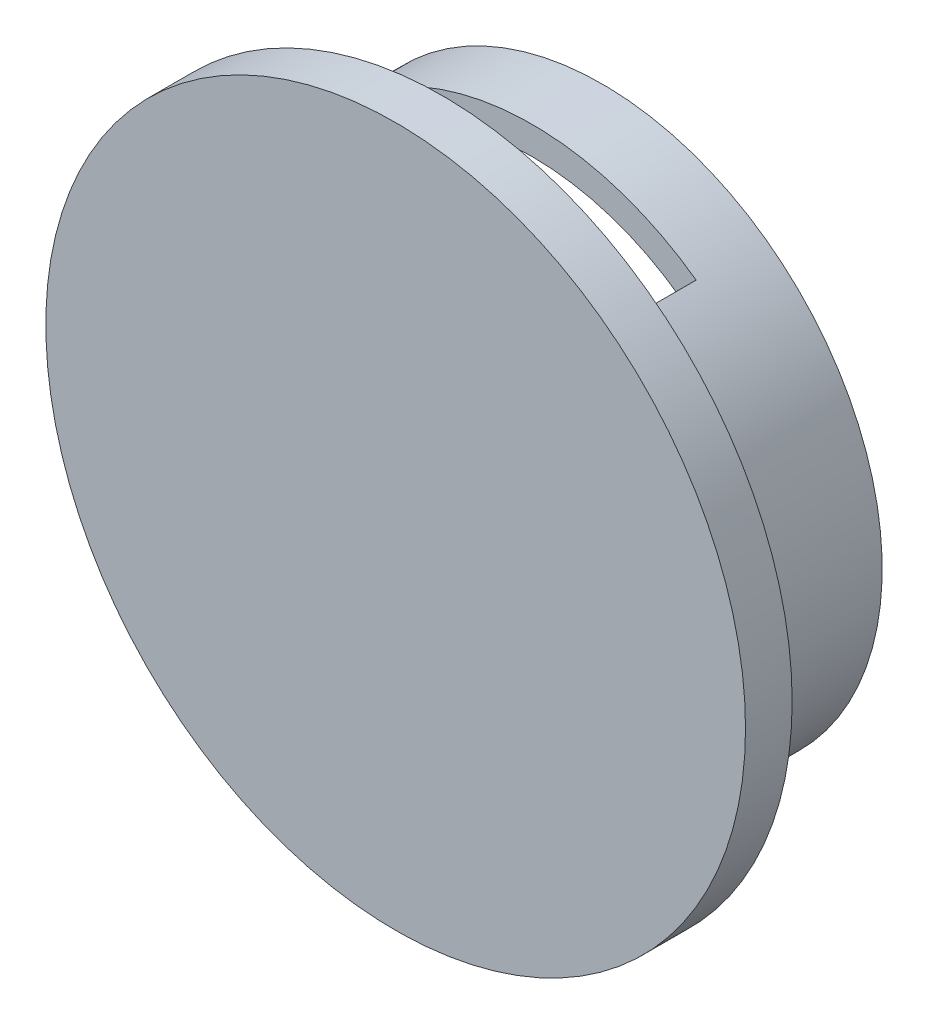
ISO-10303-21;
HEADER;
FILE_DESCRIPTION(('STEP AP214'),'2;1');
FILE_NAME('part.step','',(''),(''),'','','');
FILE_SCHEMA(('AUTOMOTIVE_DESIGN { 1 0 10303 214 1 1 1 1 }'));
ENDSEC;
DATA;
#1=APPLICATION_CONTEXT('core data for automotive mechanical design processes');
#2=APPLICATION_PROTOCOL_DEFINITION('international standard','automotive_design',2000,#1);
#3=PRODUCT_CONTEXT('',#1,'mechanical');
#4=PRODUCT('Part','Part','',(#3));
#5=PRODUCT_RELATED_PRODUCT_CATEGORY('part','',(#4));
#6=PRODUCT_DEFINITION_FORMATION('','',#4);
#7=PRODUCT_DEFINITION_CONTEXT('part definition',#1,'design');
#8=PRODUCT_DEFINITION('design','',#6,#7);
#9=PRODUCT_DEFINITION_SHAPE('','',#8);
#10=(LENGTH_UNIT() NAMED_UNIT(*) SI_UNIT(.MILLI.,.METRE.));
#11=(NAMED_UNIT(*) PLANE_ANGLE_UNIT() SI_UNIT($,.RADIAN.));
#12=(NAMED_UNIT(*) SI_UNIT($,.STERADIAN.) SOLID_ANGLE_UNIT());
#13=UNCERTAINTY_MEASURE_WITH_UNIT(LENGTH_MEASURE(1.E-05),#10,'distance_accuracy_value','');
#14=(GEOMETRIC_REPRESENTATION_CONTEXT(3) GLOBAL_UNCERTAINTY_ASSIGNED_CONTEXT((#13)) GLOBAL_UNIT_ASSIGNED_CONTEXT((#10,
#11,#12)) REPRESENTATION_CONTEXT('',''));
#15=CARTESIAN_POINT('',(0.,0.,0.));
#16=DIRECTION('',(0.,0.,1.));
#17=DIRECTION('',(1.,0.,0.));
#18=AXIS2_PLACEMENT_3D('',#15,#16,#17);
#19=CARTESIAN_POINT('',(-75.9341595570204,0.,-9.3));
#20=DIRECTION('',(1.,0.,0.));
#21=DIRECTION('',(0.,0.,-1.));
#22=AXIS2_PLACEMENT_3D('',#19,#20,#21);
#23=PLANE('',#22);
#24=DIRECTION('',(0.,0.,-1.));
#25=VECTOR('',#24,1.);
#26=CARTESIAN_POINT('',(-75.9341595570204,-19.4313729701298,-9.3));
#27=LINE('',#26,#25);
#28=CARTESIAN_POINT('',(-75.9341595570204,-19.4313729701298,-9.3));
#29=VERTEX_POINT('',#28);
#30=CARTESIAN_POINT('',(-75.9341595570204,-19.4313729701298,-19.3));
#31=VERTEX_POINT('',#30);
#32=EDGE_CURVE('E231',#29,#31,#27,.T.);
#33=ORIENTED_EDGE('',*,*,#32,.T.);
#34=DIRECTION('',(0.,-1.,0.));
#35=VECTOR('',#34,1.);
#36=CARTESIAN_POINT('',(-75.9341595570204,-11.7116516814641,-19.3));
#37=LINE('',#36,#35);
#38=CARTESIAN_POINT('',(-75.9341595570204,-11.7116516814641,-19.3));
#39=VERTEX_POINT('',#38);
#40=EDGE_CURVE('E214',#39,#31,#37,.T.);
#41=ORIENTED_EDGE('',*,*,#40,.F.);
#42=DIRECTION('',(0.,0.,-1.));
#43=VECTOR('',#42,1.);
#44=CARTESIAN_POINT('',(-75.9341595570204,-11.7116516814641,-9.3));
#45=LINE('',#44,#43);
#46=CARTESIAN_POINT('',(-75.9341595570204,-11.7116516814641,-9.3));
#47=VERTEX_POINT('',#46);
#48=EDGE_CURVE('E261',#47,#39,#45,.T.);
#49=ORIENTED_EDGE('',*,*,#48,.F.);
#50=DIRECTION('',(0.,-1.,0.));
#51=VECTOR('',#50,1.);
#52=CARTESIAN_POINT('',(-75.9341595570204,0.,-9.3));
#53=LINE('',#52,#51);
#54=EDGE_CURVE('E227',#47,#29,#53,.T.);
#55=ORIENTED_EDGE('',*,*,#54,.T.);
#56=EDGE_LOOP('',(#33,#41,#49,#55));
#57=FACE_BOUND('',#56,.T.);
#58=ADVANCED_FACE('F42',(#57),#23,.T.);
#59=CARTESIAN_POINT('',(-5.03918598073171,0.,-9.3));
#60=DIRECTION('',(1.,0.,0.));
#61=DIRECTION('',(0.,0.,-1.));
#62=AXIS2_PLACEMENT_3D('',#59,#60,#61);
#63=PLANE('',#62);
#64=DIRECTION('',(0.,-1.,0.));
#65=VECTOR('',#64,1.);
#66=CARTESIAN_POINT('',(-5.03918598073171,-12.2956066923593,-19.3));
#67=LINE('',#66,#65);
#68=CARTESIAN_POINT('',(-5.03918598073171,-12.2956066923593,-19.3));
#69=VERTEX_POINT('',#68);
#70=CARTESIAN_POINT('',(-5.03918598073171,-19.922761197767,-19.3));
#71=VERTEX_POINT('',#70);
#72=EDGE_CURVE('E64',#69,#71,#67,.T.);
#73=ORIENTED_EDGE('',*,*,#72,.T.);
#74=DIRECTION('',(0.,0.,-1.));
#75=VECTOR('',#74,1.);
#76=CARTESIAN_POINT('',(-5.03918598073171,-19.922761197767,-9.3));
#77=LINE('',#76,#75);
#78=CARTESIAN_POINT('',(-5.03918598073171,-19.922761197767,-9.3));
#79=VERTEX_POINT('',#78);
#80=EDGE_CURVE('E264',#79,#71,#77,.T.);
#81=ORIENTED_EDGE('',*,*,#80,.F.);
#82=DIRECTION('',(0.,-1.,0.));
#83=VECTOR('',#82,1.);
#84=CARTESIAN_POINT('',(-5.03918598073171,0.,-9.3));
#85=LINE('',#84,#83);
#86=CARTESIAN_POINT('',(-5.03918598073171,-12.2956066923593,-9.3));
#87=VERTEX_POINT('',#86);
#88=EDGE_CURVE('E255',#87,#79,#85,.T.);
#89=ORIENTED_EDGE('',*,*,#88,.F.);
#90=DIRECTION('',(0.,0.,-1.));
#91=VECTOR('',#90,1.);
#92=CARTESIAN_POINT('',(-5.03918598073171,-12.2956066923593,-9.3));
#93=LINE('',#92,#91);
#94=EDGE_CURVE('E59',#87,#69,#93,.T.);
#95=ORIENTED_EDGE('',*,*,#94,.T.);
#96=EDGE_LOOP('',(#73,#81,#89,#95));
#97=FACE_BOUND('',#96,.T.);
#98=ADVANCED_FACE('F299',(#97),#63,.F.);
#99=CARTESIAN_POINT('',(-40.1511488367741,28.7306052263141,-34.3));
#100=DIRECTION('',(0.,0.,1.));
#101=DIRECTION('',(1.,0.,0.));
#102=AXIS2_PLACEMENT_3D('',#99,#100,#101);
#103=CYLINDRICAL_SURFACE('',#102,60.);
#104=CARTESIAN_POINT('',(-40.1511488367741,28.7306052263141,-34.3));
#105=DIRECTION('',(0.,0.,-1.));
#106=DIRECTION('',(-1.,0.,0.));
#107=AXIS2_PLACEMENT_3D('',#104,#105,#106);
#108=CIRCLE('',#107,60.);
#109=CARTESIAN_POINT('',(-100.151148836774,28.7306052263141,-34.3));
#110=VERTEX_POINT('',#109);
#111=EDGE_CURVE('E274',#110,#110,#108,.T.);
#112=ORIENTED_EDGE('',*,*,#111,.F.);
#113=EDGE_LOOP('',(#112));
#114=FACE_BOUND('',#113,.T.);
#115=CARTESIAN_POINT('',(-40.1511488367741,28.7306052263148,-19.3));
#116=DIRECTION('',(0.,0.,-1.));
#117=DIRECTION('',(-1.,0.,0.));
#118=AXIS2_PLACEMENT_3D('',#115,#116,#117);
#119=CIRCLE('',#118,60.0000000000006);
#120=EDGE_CURVE('E211',#71,#31,#119,.T.);
#121=ORIENTED_EDGE('',*,*,#120,.T.);
#122=ORIENTED_EDGE('',*,*,#32,.F.);
#123=CARTESIAN_POINT('',(-40.1511488367741,28.7306052263141,-9.3));
#124=DIRECTION('',(0.,0.,-1.));
#125=DIRECTION('',(-1.,0.,0.));
#126=AXIS2_PLACEMENT_3D('',#123,#124,#125);
#127=CIRCLE('',#126,60.);
#128=EDGE_CURVE('E258',#79,#29,#127,.T.);
#129=ORIENTED_EDGE('',*,*,#128,.F.);
#130=ORIENTED_EDGE('',*,*,#80,.T.);
#131=EDGE_LOOP('',(#121,#122,#129,#130));
#132=FACE_BOUND('',#131,.T.);
#133=CARTESIAN_POINT('',(-40.1511488367741,28.7306052263141,0.));
#134=DIRECTION('',(0.,0.,-1.));
#135=DIRECTION('',(-1.,0.,0.));
#136=AXIS2_PLACEMENT_3D('',#133,#134,#135);
#137=CIRCLE('',#136,60.);
#138=CARTESIAN_POINT('',(-100.151148836774,28.7306052263141,0.));
#139=VERTEX_POINT('',#138);
#140=EDGE_CURVE('E12',#139,#139,#137,.T.);
#141=ORIENTED_EDGE('',*,*,#140,.T.);
#142=EDGE_LOOP('',(#141));
#143=FACE_BOUND('',#142,.T.);
#144=DIRECTION('',(0.,0.,-1.));
#145=VECTOR('',#144,1.);
#146=CARTESIAN_POINT('',(-75.2631116928165,77.3839716503952,-9.3));
#147=LINE('',#146,#145);
#148=CARTESIAN_POINT('',(-75.2631116928165,77.3839716503952,-9.3));
#149=VERTEX_POINT('',#148);
#150=CARTESIAN_POINT('',(-75.2631116928165,77.3839716503952,-19.3));
#151=VERTEX_POINT('',#150);
#152=EDGE_CURVE('E239',#149,#151,#147,.T.);
#153=ORIENTED_EDGE('',*,*,#152,.T.);
#154=CARTESIAN_POINT('',(-40.1511488367741,28.7306052263142,-19.3));
#155=DIRECTION('',(0.,0.,1.));
#156=DIRECTION('',(1.,0.,0.));
#157=AXIS2_PLACEMENT_3D('',#154,#155,#156);
#158=CIRCLE('',#157,59.9999999999999);
#159=CARTESIAN_POINT('',(-5.03918598073171,77.3839716503952,-19.3));
#160=VERTEX_POINT('',#159);
#161=EDGE_CURVE('E218',#160,#151,#158,.T.);
#162=ORIENTED_EDGE('',*,*,#161,.F.);
#163=DIRECTION('',(0.,0.,-1.));
#164=VECTOR('',#163,1.);
#165=CARTESIAN_POINT('',(-5.03918598073171,77.3839716503952,-9.3));
#166=LINE('',#165,#164);
#167=CARTESIAN_POINT('',(-5.03918598073171,77.3839716503952,-9.3));
#168=VERTEX_POINT('',#167);
#169=EDGE_CURVE('E247',#168,#160,#166,.T.);
#170=ORIENTED_EDGE('',*,*,#169,.F.);
#171=CARTESIAN_POINT('',(-40.1511488367741,28.7306052263141,-9.3));
#172=DIRECTION('',(0.,0.,-1.));
#173=DIRECTION('',(-1.,0.,0.));
#174=AXIS2_PLACEMENT_3D('',#171,#172,#173);
#175=CIRCLE('',#174,60.);
#176=EDGE_CURVE('E230',#149,#168,#175,.T.);
#177=ORIENTED_EDGE('',*,*,#176,.F.);
#178=EDGE_LOOP('',(#153,#162,#170,#177));
#179=FACE_BOUND('',#178,.T.);
#180=ADVANCED_FACE('F306',(#114,#132,#143,#179),#103,.T.);
#181=CARTESIAN_POINT('',(-40.1511488367741,28.7306052263141,-34.3));
#182=DIRECTION('',(0.,0.,-1.));
#183=DIRECTION('',(-1.,0.,0.));
#184=AXIS2_PLACEMENT_3D('',#181,#182,#183);
#185=PLANE('',#184);
#186=ORIENTED_EDGE('',*,*,#111,.T.);
#187=EDGE_LOOP('',(#186));
#188=FACE_BOUND('',#187,.T.);
#189=CARTESIAN_POINT('',(-40.1511488367741,28.7306052263141,-34.3));
#190=DIRECTION('',(0.,0.,-1.));
#191=DIRECTION('',(-1.,0.,0.));
#192=AXIS2_PLACEMENT_3D('',#189,#190,#191);
#193=CIRCLE('',#192,54.);
#194=CARTESIAN_POINT('',(-94.1511488367741,28.7306052263141,-34.3));
#195=VERTEX_POINT('',#194);
#196=EDGE_CURVE('E243',#195,#195,#193,.T.);
#197=ORIENTED_EDGE('',*,*,#196,.F.);
#198=EDGE_LOOP('',(#197));
#199=FACE_BOUND('',#198,.T.);
#200=ADVANCED_FACE('F313',(#188,#199),#185,.T.);
#201=CARTESIAN_POINT('',(-40.1511488367741,28.7306052263141,-34.3));
#202=DIRECTION('',(0.,0.,1.));
#203=DIRECTION('',(1.,0.,0.));
#204=AXIS2_PLACEMENT_3D('',#201,#202,#203);
#205=CYLINDRICAL_SURFACE('',#204,54.);
#206=ORIENTED_EDGE('',*,*,#196,.T.);
#207=EDGE_LOOP('',(#206));
#208=FACE_BOUND('',#207,.T.);
#209=ORIENTED_EDGE('',*,*,#48,.T.);
#210=CARTESIAN_POINT('',(-40.1511488367741,28.7306052263142,-19.3));
#211=DIRECTION('',(0.,0.,-1.));
#212=DIRECTION('',(-1.,0.,0.));
#213=AXIS2_PLACEMENT_3D('',#210,#211,#212);
#214=CIRCLE('',#213,54.0000000000001);
#215=EDGE_CURVE('E216',#69,#39,#214,.T.);
#216=ORIENTED_EDGE('',*,*,#215,.F.);
#217=ORIENTED_EDGE('',*,*,#94,.F.);
#218=CARTESIAN_POINT('',(-40.1511488367741,28.7306052263141,-9.3));
#219=DIRECTION('',(0.,0.,-1.));
#220=DIRECTION('',(-1.,0.,0.));
#221=AXIS2_PLACEMENT_3D('',#218,#219,#220);
#222=CIRCLE('',#221,54.);
#223=EDGE_CURVE('E252',#47,#87,#222,.F.);
#224=ORIENTED_EDGE('',*,*,#223,.F.);
#225=EDGE_LOOP('',(#209,#216,#217,#224));
#226=FACE_BOUND('',#225,.T.);
#227=CARTESIAN_POINT('',(-40.1511488367741,28.7306052263141,4.));
#228=DIRECTION('',(0.,0.,1.));
#229=DIRECTION('',(1.,0.,0.));
#230=AXIS2_PLACEMENT_3D('',#227,#228,#229);
#231=CIRCLE('',#230,54.);
#232=CARTESIAN_POINT('',(13.8488511632259,28.7306052263141,4.));
#233=VERTEX_POINT('',#232);
#234=EDGE_CURVE('E271',#233,#233,#231,.F.);
#235=ORIENTED_EDGE('',*,*,#234,.F.);
#236=EDGE_LOOP('',(#235));
#237=FACE_BOUND('',#236,.T.);
#238=CARTESIAN_POINT('',(-40.1511488367741,28.730605226314,-19.3));
#239=DIRECTION('',(0.,0.,1.));
#240=DIRECTION('',(1.,0.,0.));
#241=AXIS2_PLACEMENT_3D('',#238,#239,#240);
#242=CIRCLE('',#241,54.0000000000001);
#243=CARTESIAN_POINT('',(-5.03918598073171,69.7568171449875,-19.3));
#244=VERTEX_POINT('',#243);
#245=CARTESIAN_POINT('',(-75.2631116928165,69.7568171449875,-19.3));
#246=VERTEX_POINT('',#245);
#247=EDGE_CURVE('E222',#244,#246,#242,.T.);
#248=ORIENTED_EDGE('',*,*,#247,.T.);
#249=DIRECTION('',(0.,0.,-1.));
#250=VECTOR('',#249,1.);
#251=CARTESIAN_POINT('',(-75.2631116928165,69.7568171449875,-9.3));
#252=LINE('',#251,#250);
#253=CARTESIAN_POINT('',(-75.2631116928165,69.7568171449875,-9.3));
#254=VERTEX_POINT('',#253);
#255=EDGE_CURVE('E240',#254,#246,#252,.T.);
#256=ORIENTED_EDGE('',*,*,#255,.F.);
#257=CARTESIAN_POINT('',(-40.1511488367741,28.7306052263141,-9.3));
#258=DIRECTION('',(0.,0.,-1.));
#259=DIRECTION('',(-1.,0.,0.));
#260=AXIS2_PLACEMENT_3D('',#257,#258,#259);
#261=CIRCLE('',#260,54.);
#262=CARTESIAN_POINT('',(-5.0391859807317,69.7568171449875,-9.3));
#263=VERTEX_POINT('',#262);
#264=EDGE_CURVE('E236',#263,#254,#261,.F.);
#265=ORIENTED_EDGE('',*,*,#264,.F.);
#266=DIRECTION('',(0.,0.,-1.));
#267=VECTOR('',#266,1.);
#268=CARTESIAN_POINT('',(-5.03918598073171,69.7568171449875,-9.3));
#269=LINE('',#268,#267);
#270=EDGE_CURVE('E244',#263,#244,#269,.T.);
#271=ORIENTED_EDGE('',*,*,#270,.T.);
#272=EDGE_LOOP('',(#248,#256,#265,#271));
#273=FACE_BOUND('',#272,.T.);
#274=ADVANCED_FACE('F310',(#208,#226,#237,#273),#205,.F.);
#275=CARTESIAN_POINT('',(-40.1511488367741,28.7306052263141,10.));
#276=DIRECTION('',(0.,0.,-1.));
#277=DIRECTION('',(-1.,0.,0.));
#278=AXIS2_PLACEMENT_3D('',#275,#276,#277);
#279=CYLINDRICAL_SURFACE('',#278,75.);
#280=CARTESIAN_POINT('',(-40.1511488367741,28.7306052263141,10.));
#281=DIRECTION('',(0.,0.,1.));
#282=DIRECTION('',(1.,0.,0.));
#283=AXIS2_PLACEMENT_3D('',#280,#281,#282);
#284=CIRCLE('',#283,75.);
#285=CARTESIAN_POINT('',(34.8488511632259,28.7306052263141,10.));
#286=VERTEX_POINT('',#285);
#287=EDGE_CURVE('E51',#286,#286,#284,.T.);
#288=ORIENTED_EDGE('',*,*,#287,.F.);
#289=EDGE_LOOP('',(#288));
#290=FACE_BOUND('',#289,.T.);
#291=CARTESIAN_POINT('',(-40.1511488367741,28.7306052263141,0.));
#292=DIRECTION('',(0.,0.,1.));
#293=DIRECTION('',(1.,0.,0.));
#294=AXIS2_PLACEMENT_3D('',#291,#292,#293);
#295=CIRCLE('',#294,75.);
#296=CARTESIAN_POINT('',(34.8488511632259,28.7306052263141,0.));
#297=VERTEX_POINT('',#296);
#298=EDGE_CURVE('E46',#297,#297,#295,.T.);
#299=ORIENTED_EDGE('',*,*,#298,.T.);
#300=EDGE_LOOP('',(#299));
#301=FACE_BOUND('',#300,.T.);
#302=ADVANCED_FACE('F44',(#290,#301),#279,.T.);
#303=CARTESIAN_POINT('',(-40.1511488367741,28.7306052263141,10.));
#304=DIRECTION('',(0.,0.,1.));
#305=DIRECTION('',(1.,0.,0.));
#306=AXIS2_PLACEMENT_3D('',#303,#304,#305);
#307=PLANE('',#306);
#308=ORIENTED_EDGE('',*,*,#287,.T.);
#309=EDGE_LOOP('',(#308));
#310=FACE_BOUND('',#309,.T.);
#311=ADVANCED_FACE('F286',(#310),#307,.T.);
#312=CARTESIAN_POINT('',(-40.1511488367741,28.7306052263141,0.));
#313=DIRECTION('',(0.,0.,1.));
#314=DIRECTION('',(1.,0.,0.));
#315=AXIS2_PLACEMENT_3D('',#312,#313,#314);
#316=PLANE('',#315);
#317=ORIENTED_EDGE('',*,*,#140,.F.);
#318=EDGE_LOOP('',(#317));
#319=FACE_BOUND('',#318,.T.);
#320=ORIENTED_EDGE('',*,*,#298,.F.);
#321=EDGE_LOOP('',(#320));
#322=FACE_BOUND('',#321,.T.);
#323=ADVANCED_FACE('F283',(#319,#322),#316,.F.);
#324=CARTESIAN_POINT('',(-40.1511488367741,28.7306052263141,4.));
#325=DIRECTION('',(0.,0.,1.));
#326=DIRECTION('',(1.,0.,0.));
#327=AXIS2_PLACEMENT_3D('',#324,#325,#326);
#328=PLANE('',#327);
#329=CARTESIAN_POINT('',(-10.0991106363457,58.7826434267423,4.));
#330=DIRECTION('',(0.,0.,-1.));
#331=DIRECTION('',(-1.,0.,0.));
#332=AXIS2_PLACEMENT_3D('',#329,#330,#331);
#333=CIRCLE('',#332,1.775);
#334=CARTESIAN_POINT('',(-11.8741106363457,58.7826434267423,4.));
#335=VERTEX_POINT('',#334);
#336=EDGE_CURVE('E147',#335,#335,#333,.T.);
#337=ORIENTED_EDGE('',*,*,#336,.F.);
#338=EDGE_LOOP('',(#337));
#339=FACE_BOUND('',#338,.T.);
#340=CARTESIAN_POINT('',(-70.2031870372023,58.7826434267424,4.));
#341=DIRECTION('',(0.,0.,-1.));
#342=DIRECTION('',(-1.,0.,0.));
#343=AXIS2_PLACEMENT_3D('',#340,#341,#342);
#344=CIRCLE('',#343,1.775);
#345=CARTESIAN_POINT('',(-71.9781870372023,58.7826434267424,4.));
#346=VERTEX_POINT('',#345);
#347=EDGE_CURVE('E140',#346,#346,#344,.T.);
#348=ORIENTED_EDGE('',*,*,#347,.F.);
#349=EDGE_LOOP('',(#348));
#350=FACE_BOUND('',#349,.T.);
#351=CARTESIAN_POINT('',(-70.2031870372024,-1.3214329741141,4.));
#352=DIRECTION('',(0.,0.,-1.));
#353=DIRECTION('',(-1.,0.,0.));
#354=AXIS2_PLACEMENT_3D('',#351,#352,#353);
#355=CIRCLE('',#354,1.775);
#356=CARTESIAN_POINT('',(-71.9781870372024,-1.3214329741141,4.));
#357=VERTEX_POINT('',#356);
#358=EDGE_CURVE('E156',#357,#357,#355,.T.);
#359=ORIENTED_EDGE('',*,*,#358,.F.);
#360=EDGE_LOOP('',(#359));
#361=FACE_BOUND('',#360,.T.);
#362=CARTESIAN_POINT('',(-10.0991106363459,-1.32143297411421,4.));
#363=DIRECTION('',(0.,0.,-1.));
#364=DIRECTION('',(-1.,0.,0.));
#365=AXIS2_PLACEMENT_3D('',#362,#363,#364);
#366=CIRCLE('',#365,1.775);
#367=CARTESIAN_POINT('',(-11.8741106363459,-1.32143297411421,4.));
#368=VERTEX_POINT('',#367);
#369=EDGE_CURVE('E165',#368,#368,#366,.T.);
#370=ORIENTED_EDGE('',*,*,#369,.F.);
#371=EDGE_LOOP('',(#370));
#372=FACE_BOUND('',#371,.T.);
#373=CARTESIAN_POINT('',(-40.1511488367741,71.2306052263141,4.));
#374=DIRECTION('',(0.,0.,-1.));
#375=DIRECTION('',(-1.,0.,0.));
#376=AXIS2_PLACEMENT_3D('',#373,#374,#375);
#377=CIRCLE('',#376,1.775);
#378=CARTESIAN_POINT('',(-41.9261488367741,71.2306052263141,4.));
#379=VERTEX_POINT('',#378);
#380=EDGE_CURVE('E174',#379,#379,#377,.T.);
#381=ORIENTED_EDGE('',*,*,#380,.F.);
#382=EDGE_LOOP('',(#381));
#383=FACE_BOUND('',#382,.T.);
#384=CARTESIAN_POINT('',(-82.6511488367741,28.7306052263141,4.));
#385=DIRECTION('',(0.,0.,-1.));
#386=DIRECTION('',(-1.,0.,0.));
#387=AXIS2_PLACEMENT_3D('',#384,#385,#386);
#388=CIRCLE('',#387,1.775);
#389=CARTESIAN_POINT('',(-84.4261488367741,28.7306052263141,4.));
#390=VERTEX_POINT('',#389);
#391=EDGE_CURVE('E183',#390,#390,#388,.T.);
#392=ORIENTED_EDGE('',*,*,#391,.F.);
#393=EDGE_LOOP('',(#392));
#394=FACE_BOUND('',#393,.T.);
#395=CARTESIAN_POINT('',(-40.1511488367741,-13.7693947736859,4.));
#396=DIRECTION('',(0.,0.,-1.));
#397=DIRECTION('',(-1.,0.,0.));
#398=AXIS2_PLACEMENT_3D('',#395,#396,#397);
#399=CIRCLE('',#398,1.775);
#400=CARTESIAN_POINT('',(-41.9261488367741,-13.7693947736859,4.));
#401=VERTEX_POINT('',#400);
#402=EDGE_CURVE('E192',#401,#401,#399,.T.);
#403=ORIENTED_EDGE('',*,*,#402,.F.);
#404=EDGE_LOOP('',(#403));
#405=FACE_BOUND('',#404,.T.);
#406=CARTESIAN_POINT('',(2.34885116322592,28.7306052263141,4.));
#407=DIRECTION('',(0.,0.,-1.));
#408=DIRECTION('',(-1.,0.,0.));
#409=AXIS2_PLACEMENT_3D('',#406,#407,#408);
#410=CIRCLE('',#409,1.775);
#411=CARTESIAN_POINT('',(0.573851163225917,28.7306052263141,4.));
#412=VERTEX_POINT('',#411);
#413=EDGE_CURVE('E201',#412,#412,#410,.T.);
#414=ORIENTED_EDGE('',*,*,#413,.F.);
#415=EDGE_LOOP('',(#414));
#416=FACE_BOUND('',#415,.T.);
#417=ORIENTED_EDGE('',*,*,#234,.T.);
#418=EDGE_LOOP('',(#417));
#419=FACE_BOUND('',#418,.T.);
#420=ADVANCED_FACE('F285',(#339,#350,#361,#372,#383,#394,#405,#416,#419),#328,.F.);
#421=CARTESIAN_POINT('',(0.,0.,-9.3));
#422=DIRECTION('',(0.,0.,-1.));
#423=DIRECTION('',(-1.,0.,0.));
#424=AXIS2_PLACEMENT_3D('',#421,#422,#423);
#425=PLANE('',#424);
#426=ORIENTED_EDGE('',*,*,#54,.F.);
#427=ORIENTED_EDGE('',*,*,#223,.T.);
#428=ORIENTED_EDGE('',*,*,#88,.T.);
#429=ORIENTED_EDGE('',*,*,#128,.T.);
#430=EDGE_LOOP('',(#426,#427,#428,#429));
#431=FACE_BOUND('',#430,.T.);
#432=ADVANCED_FACE('F293',(#431),#425,.T.);
#433=CARTESIAN_POINT('',(-75.2631116928165,0.,-9.3));
#434=DIRECTION('',(1.,0.,0.));
#435=DIRECTION('',(0.,0.,-1.));
#436=AXIS2_PLACEMENT_3D('',#433,#434,#435);
#437=PLANE('',#436);
#438=DIRECTION('',(0.,-1.,0.));
#439=VECTOR('',#438,1.);
#440=CARTESIAN_POINT('',(-75.2631116928165,77.3839716503952,-19.3));
#441=LINE('',#440,#439);
#442=EDGE_CURVE('E220',#151,#246,#441,.T.);
#443=ORIENTED_EDGE('',*,*,#442,.F.);
#444=ORIENTED_EDGE('',*,*,#152,.F.);
#445=DIRECTION('',(0.,-1.,0.));
#446=VECTOR('',#445,1.);
#447=CARTESIAN_POINT('',(-75.2631116928165,0.,-9.3));
#448=LINE('',#447,#446);
#449=EDGE_CURVE('E228',#149,#254,#448,.T.);
#450=ORIENTED_EDGE('',*,*,#449,.T.);
#451=ORIENTED_EDGE('',*,*,#255,.T.);
#452=EDGE_LOOP('',(#443,#444,#450,#451));
#453=FACE_BOUND('',#452,.T.);
#454=ADVANCED_FACE('F335',(#453),#437,.T.);
#455=CARTESIAN_POINT('',(-5.03918598073171,0.,-9.3));
#456=DIRECTION('',(1.,0.,0.));
#457=DIRECTION('',(0.,0.,-1.));
#458=AXIS2_PLACEMENT_3D('',#455,#456,#457);
#459=PLANE('',#458);
#460=ORIENTED_EDGE('',*,*,#169,.T.);
#461=DIRECTION('',(0.,-1.,0.));
#462=VECTOR('',#461,1.);
#463=CARTESIAN_POINT('',(-5.03918598073171,77.3839716503952,-19.3));
#464=LINE('',#463,#462);
#465=EDGE_CURVE('E225',#160,#244,#464,.T.);
#466=ORIENTED_EDGE('',*,*,#465,.T.);
#467=ORIENTED_EDGE('',*,*,#270,.F.);
#468=DIRECTION('',(0.,-1.,0.));
#469=VECTOR('',#468,1.);
#470=CARTESIAN_POINT('',(-5.03918598073171,0.,-9.3));
#471=LINE('',#470,#469);
#472=EDGE_CURVE('E234',#168,#263,#471,.T.);
#473=ORIENTED_EDGE('',*,*,#472,.F.);
#474=EDGE_LOOP('',(#460,#466,#467,#473));
#475=FACE_BOUND('',#474,.T.);
#476=ADVANCED_FACE('F346',(#475),#459,.F.);
#477=CARTESIAN_POINT('',(0.,0.,-9.3));
#478=DIRECTION('',(0.,0.,-1.));
#479=DIRECTION('',(-1.,0.,0.));
#480=AXIS2_PLACEMENT_3D('',#477,#478,#479);
#481=PLANE('',#480);
#482=ORIENTED_EDGE('',*,*,#449,.F.);
#483=ORIENTED_EDGE('',*,*,#176,.T.);
#484=ORIENTED_EDGE('',*,*,#472,.T.);
#485=ORIENTED_EDGE('',*,*,#264,.T.);
#486=EDGE_LOOP('',(#482,#483,#484,#485));
#487=FACE_BOUND('',#486,.T.);
#488=ADVANCED_FACE('F337',(#487),#481,.T.);
#489=CARTESIAN_POINT('',(-40.1511488367741,28.7306052263142,-19.3));
#490=DIRECTION('',(0.,0.,1.));
#491=DIRECTION('',(1.,0.,0.));
#492=AXIS2_PLACEMENT_3D('',#489,#490,#491);
#493=PLANE('',#492);
#494=ORIENTED_EDGE('',*,*,#161,.T.);
#495=ORIENTED_EDGE('',*,*,#442,.T.);
#496=ORIENTED_EDGE('',*,*,#247,.F.);
#497=ORIENTED_EDGE('',*,*,#465,.F.);
#498=EDGE_LOOP('',(#494,#495,#496,#497));
#499=FACE_BOUND('',#498,.T.);
#500=ADVANCED_FACE('F344',(#499),#493,.T.);
#501=CARTESIAN_POINT('',(-40.1511488367741,28.7306052263142,-19.3));
#502=DIRECTION('',(0.,0.,-1.));
#503=DIRECTION('',(-1.,0.,0.));
#504=AXIS2_PLACEMENT_3D('',#501,#502,#503);
#505=PLANE('',#504);
#506=ORIENTED_EDGE('',*,*,#215,.T.);
#507=ORIENTED_EDGE('',*,*,#40,.T.);
#508=ORIENTED_EDGE('',*,*,#120,.F.);
#509=ORIENTED_EDGE('',*,*,#72,.F.);
#510=EDGE_LOOP('',(#506,#507,#508,#509));
#511=FACE_BOUND('',#510,.T.);
#512=ADVANCED_FACE('F366',(#511),#505,.F.);
#513=CARTESIAN_POINT('',(2.34885116322592,28.7306052263141,9.));
#514=DIRECTION('',(0.,0.,-1.));
#515=DIRECTION('',(-1.,0.,0.));
#516=AXIS2_PLACEMENT_3D('',#513,#514,#515);
#517=CONICAL_SURFACE('',#516,1.45,1.02974425867665);
#518=CARTESIAN_POINT('',(2.34885116322592,28.7306052263141,9.87124789758996));
#519=VERTEX_POINT('',#518);
#520=VERTEX_LOOP('',#519);
#521=FACE_BOUND('',#520,.T.);
#522=CARTESIAN_POINT('',(2.34885116322592,28.7306052263141,9.));
#523=DIRECTION('',(0.,0.,-1.));
#524=DIRECTION('',(-1.,0.,0.));
#525=AXIS2_PLACEMENT_3D('',#522,#523,#524);
#526=CIRCLE('',#525,1.45);
#527=CARTESIAN_POINT('',(0.89885116322592,28.7306052263141,9.));
#528=VERTEX_POINT('',#527);
#529=EDGE_CURVE('E207',#528,#528,#526,.T.);
#530=ORIENTED_EDGE('',*,*,#529,.T.);
#531=EDGE_LOOP('',(#530));
#532=FACE_BOUND('',#531,.T.);
#533=ADVANCED_FACE('F368',(#521,#532),#517,.F.);
#534=CARTESIAN_POINT('',(2.34885116322592,28.7306052263141,4.));
#535=DIRECTION('',(0.,0.,-1.));
#536=DIRECTION('',(-1.,0.,0.));
#537=AXIS2_PLACEMENT_3D('',#534,#535,#536);
#538=CYLINDRICAL_SURFACE('',#537,1.45);
#539=ORIENTED_EDGE('',*,*,#529,.F.);
#540=EDGE_LOOP('',(#539));
#541=FACE_BOUND('',#540,.T.);
#542=CARTESIAN_POINT('',(2.34885116322592,28.7306052263141,4.325));
#543=DIRECTION('',(0.,0.,-1.));
#544=DIRECTION('',(-1.,0.,0.));
#545=AXIS2_PLACEMENT_3D('',#542,#543,#544);
#546=CIRCLE('',#545,1.45);
#547=CARTESIAN_POINT('',(0.89885116322592,28.7306052263141,4.325));
#548=VERTEX_POINT('',#547);
#549=EDGE_CURVE('E204',#548,#548,#546,.T.);
#550=ORIENTED_EDGE('',*,*,#549,.T.);
#551=EDGE_LOOP('',(#550));
#552=FACE_BOUND('',#551,.T.);
#553=ADVANCED_FACE('F373',(#541,#552),#538,.F.);
#554=CARTESIAN_POINT('',(2.34885116322592,28.7306052263141,4.));
#555=DIRECTION('',(0.,0.,-1.));
#556=DIRECTION('',(-1.,0.,0.));
#557=AXIS2_PLACEMENT_3D('',#554,#555,#556);
#558=CONICAL_SURFACE('',#557,1.775,0.785398163397451);
#559=ORIENTED_EDGE('',*,*,#549,.F.);
#560=EDGE_LOOP('',(#559));
#561=FACE_BOUND('',#560,.T.);
#562=ORIENTED_EDGE('',*,*,#413,.T.);
#563=EDGE_LOOP('',(#562));
#564=FACE_BOUND('',#563,.T.);
#565=ADVANCED_FACE('F379',(#561,#564),#558,.F.);
#566=CARTESIAN_POINT('',(-40.1511488367741,-13.7693947736859,9.));
#567=DIRECTION('',(0.,0.,-1.));
#568=DIRECTION('',(-1.,0.,0.));
#569=AXIS2_PLACEMENT_3D('',#566,#567,#568);
#570=CONICAL_SURFACE('',#569,1.45,1.02974425867665);
#571=CARTESIAN_POINT('',(-40.1511488367741,-13.7693947736859,9.87124789758996));
#572=VERTEX_POINT('',#571);
#573=VERTEX_LOOP('',#572);
#574=FACE_BOUND('',#573,.T.);
#575=CARTESIAN_POINT('',(-40.1511488367741,-13.7693947736859,9.));
#576=DIRECTION('',(0.,0.,-1.));
#577=DIRECTION('',(-1.,0.,0.));
#578=AXIS2_PLACEMENT_3D('',#575,#576,#577);
#579=CIRCLE('',#578,1.45);
#580=CARTESIAN_POINT('',(-41.6011488367741,-13.7693947736859,9.));
#581=VERTEX_POINT('',#580);
#582=EDGE_CURVE('E198',#581,#581,#579,.T.);
#583=ORIENTED_EDGE('',*,*,#582,.T.);
#584=EDGE_LOOP('',(#583));
#585=FACE_BOUND('',#584,.T.);
#586=ADVANCED_FACE('F383',(#574,#585),#570,.F.);
#587=CARTESIAN_POINT('',(-40.1511488367741,-13.7693947736859,4.));
#588=DIRECTION('',(0.,0.,-1.));
#589=DIRECTION('',(-1.,0.,0.));
#590=AXIS2_PLACEMENT_3D('',#587,#588,#589);
#591=CYLINDRICAL_SURFACE('',#590,1.45);
#592=ORIENTED_EDGE('',*,*,#582,.F.);
#593=EDGE_LOOP('',(#592));
#594=FACE_BOUND('',#593,.T.);
#595=CARTESIAN_POINT('',(-40.1511488367741,-13.7693947736859,4.325));
#596=DIRECTION('',(0.,0.,-1.));
#597=DIRECTION('',(-1.,0.,0.));
#598=AXIS2_PLACEMENT_3D('',#595,#596,#597);
#599=CIRCLE('',#598,1.45);
#600=CARTESIAN_POINT('',(-41.6011488367741,-13.7693947736859,4.325));
#601=VERTEX_POINT('',#600);
#602=EDGE_CURVE('E195',#601,#601,#599,.T.);
#603=ORIENTED_EDGE('',*,*,#602,.T.);
#604=EDGE_LOOP('',(#603));
#605=FACE_BOUND('',#604,.T.);
#606=ADVANCED_FACE('F387',(#594,#605),#591,.F.);
#607=CARTESIAN_POINT('',(-40.1511488367741,-13.7693947736859,4.));
#608=DIRECTION('',(0.,0.,-1.));
#609=DIRECTION('',(-1.,0.,0.));
#610=AXIS2_PLACEMENT_3D('',#607,#608,#609);
#611=CONICAL_SURFACE('',#610,1.775,0.785398163397446);
#612=ORIENTED_EDGE('',*,*,#602,.F.);
#613=EDGE_LOOP('',(#612));
#614=FACE_BOUND('',#613,.T.);
#615=ORIENTED_EDGE('',*,*,#402,.T.);
#616=EDGE_LOOP('',(#615));
#617=FACE_BOUND('',#616,.T.);
#618=ADVANCED_FACE('F391',(#614,#617),#611,.F.);
#619=CARTESIAN_POINT('',(-82.6511488367741,28.7306052263141,9.));
#620=DIRECTION('',(0.,0.,-1.));
#621=DIRECTION('',(-1.,0.,0.));
#622=AXIS2_PLACEMENT_3D('',#619,#620,#621);
#623=CONICAL_SURFACE('',#622,1.44999999999999,1.02974425867665);
#624=CARTESIAN_POINT('',(-82.6511488367741,28.7306052263141,9.87124789758996));
#625=VERTEX_POINT('',#624);
#626=VERTEX_LOOP('',#625);
#627=FACE_BOUND('',#626,.T.);
#628=CARTESIAN_POINT('',(-82.6511488367741,28.7306052263141,9.));
#629=DIRECTION('',(0.,0.,-1.));
#630=DIRECTION('',(-1.,0.,0.));
#631=AXIS2_PLACEMENT_3D('',#628,#629,#630);
#632=CIRCLE('',#631,1.44999999999999);
#633=CARTESIAN_POINT('',(-84.1011488367741,28.7306052263141,9.));
#634=VERTEX_POINT('',#633);
#635=EDGE_CURVE('E189',#634,#634,#632,.T.);
#636=ORIENTED_EDGE('',*,*,#635,.T.);
#637=EDGE_LOOP('',(#636));
#638=FACE_BOUND('',#637,.T.);
#639=ADVANCED_FACE('F395',(#627,#638),#623,.F.);
#640=CARTESIAN_POINT('',(-82.6511488367741,28.7306052263141,4.));
#641=DIRECTION('',(0.,0.,-1.));
#642=DIRECTION('',(-1.,0.,0.));
#643=AXIS2_PLACEMENT_3D('',#640,#641,#642);
#644=CYLINDRICAL_SURFACE('',#643,1.44999999999999);
#645=ORIENTED_EDGE('',*,*,#635,.F.);
#646=EDGE_LOOP('',(#645));
#647=FACE_BOUND('',#646,.T.);
#648=CARTESIAN_POINT('',(-82.6511488367741,28.7306052263141,4.325));
#649=DIRECTION('',(0.,0.,-1.));
#650=DIRECTION('',(-1.,0.,0.));
#651=AXIS2_PLACEMENT_3D('',#648,#649,#650);
#652=CIRCLE('',#651,1.44999999999999);
#653=CARTESIAN_POINT('',(-84.1011488367741,28.7306052263141,4.325));
#654=VERTEX_POINT('',#653);
#655=EDGE_CURVE('E186',#654,#654,#652,.T.);
#656=ORIENTED_EDGE('',*,*,#655,.T.);
#657=EDGE_LOOP('',(#656));
#658=FACE_BOUND('',#657,.T.);
#659=ADVANCED_FACE('F399',(#647,#658),#644,.F.);
#660=CARTESIAN_POINT('',(-82.6511488367741,28.7306052263141,4.));
#661=DIRECTION('',(0.,0.,-1.));
#662=DIRECTION('',(-1.,0.,0.));
#663=AXIS2_PLACEMENT_3D('',#660,#661,#662);
#664=CONICAL_SURFACE('',#663,1.775,0.785398163397456);
#665=ORIENTED_EDGE('',*,*,#655,.F.);
#666=EDGE_LOOP('',(#665));
#667=FACE_BOUND('',#666,.T.);
#668=ORIENTED_EDGE('',*,*,#391,.T.);
#669=EDGE_LOOP('',(#668));
#670=FACE_BOUND('',#669,.T.);
#671=ADVANCED_FACE('F403',(#667,#670),#664,.F.);
#672=CARTESIAN_POINT('',(-40.1511488367741,71.2306052263141,9.));
#673=DIRECTION('',(0.,0.,-1.));
#674=DIRECTION('',(-1.,0.,0.));
#675=AXIS2_PLACEMENT_3D('',#672,#673,#674);
#676=CONICAL_SURFACE('',#675,1.45,1.02974425867665);
#677=CARTESIAN_POINT('',(-40.1511488367741,71.2306052263141,9.87124789758996));
#678=VERTEX_POINT('',#677);
#679=VERTEX_LOOP('',#678);
#680=FACE_BOUND('',#679,.T.);
#681=CARTESIAN_POINT('',(-40.1511488367741,71.2306052263141,9.));
#682=DIRECTION('',(0.,0.,-1.));
#683=DIRECTION('',(-1.,0.,0.));
#684=AXIS2_PLACEMENT_3D('',#681,#682,#683);
#685=CIRCLE('',#684,1.45);
#686=CARTESIAN_POINT('',(-41.6011488367741,71.2306052263141,9.));
#687=VERTEX_POINT('',#686);
#688=EDGE_CURVE('E180',#687,#687,#685,.T.);
#689=ORIENTED_EDGE('',*,*,#688,.T.);
#690=EDGE_LOOP('',(#689));
#691=FACE_BOUND('',#690,.T.);
#692=ADVANCED_FACE('F407',(#680,#691),#676,.F.);
#693=CARTESIAN_POINT('',(-40.1511488367741,71.2306052263141,4.));
#694=DIRECTION('',(0.,0.,-1.));
#695=DIRECTION('',(-1.,0.,0.));
#696=AXIS2_PLACEMENT_3D('',#693,#694,#695);
#697=CYLINDRICAL_SURFACE('',#696,1.45);
#698=ORIENTED_EDGE('',*,*,#688,.F.);
#699=EDGE_LOOP('',(#698));
#700=FACE_BOUND('',#699,.T.);
#701=CARTESIAN_POINT('',(-40.1511488367741,71.2306052263141,4.325));
#702=DIRECTION('',(0.,0.,-1.));
#703=DIRECTION('',(-1.,0.,0.));
#704=AXIS2_PLACEMENT_3D('',#701,#702,#703);
#705=CIRCLE('',#704,1.45);
#706=CARTESIAN_POINT('',(-41.6011488367741,71.2306052263141,4.325));
#707=VERTEX_POINT('',#706);
#708=EDGE_CURVE('E177',#707,#707,#705,.T.);
#709=ORIENTED_EDGE('',*,*,#708,.T.);
#710=EDGE_LOOP('',(#709));
#711=FACE_BOUND('',#710,.T.);
#712=ADVANCED_FACE('F411',(#700,#711),#697,.F.);
#713=CARTESIAN_POINT('',(-40.1511488367741,71.2306052263141,4.));
#714=DIRECTION('',(0.,0.,-1.));
#715=DIRECTION('',(-1.,0.,0.));
#716=AXIS2_PLACEMENT_3D('',#713,#714,#715);
#717=CONICAL_SURFACE('',#716,1.775,0.785398163397446);
#718=ORIENTED_EDGE('',*,*,#708,.F.);
#719=EDGE_LOOP('',(#718));
#720=FACE_BOUND('',#719,.T.);
#721=ORIENTED_EDGE('',*,*,#380,.T.);
#722=EDGE_LOOP('',(#721));
#723=FACE_BOUND('',#722,.T.);
#724=ADVANCED_FACE('F415',(#720,#723),#717,.F.);
#725=CARTESIAN_POINT('',(-10.0991106363459,-1.32143297411421,9.));
#726=DIRECTION('',(0.,0.,-1.));
#727=DIRECTION('',(-1.,0.,0.));
#728=AXIS2_PLACEMENT_3D('',#725,#726,#727);
#729=CONICAL_SURFACE('',#728,1.45,1.02974425867665);
#730=CARTESIAN_POINT('',(-10.0991106363459,-1.32143297411421,9.87124789758996));
#731=VERTEX_POINT('',#730);
#732=VERTEX_LOOP('',#731);
#733=FACE_BOUND('',#732,.T.);
#734=CARTESIAN_POINT('',(-10.0991106363459,-1.32143297411421,9.));
#735=DIRECTION('',(0.,0.,-1.));
#736=DIRECTION('',(-1.,0.,0.));
#737=AXIS2_PLACEMENT_3D('',#734,#735,#736);
#738=CIRCLE('',#737,1.45);
#739=CARTESIAN_POINT('',(-11.5491106363459,-1.32143297411421,9.));
#740=VERTEX_POINT('',#739);
#741=EDGE_CURVE('E171',#740,#740,#738,.T.);
#742=ORIENTED_EDGE('',*,*,#741,.T.);
#743=EDGE_LOOP('',(#742));
#744=FACE_BOUND('',#743,.T.);
#745=ADVANCED_FACE('F419',(#733,#744),#729,.F.);
#746=CARTESIAN_POINT('',(-10.0991106363459,-1.32143297411421,4.));
#747=DIRECTION('',(0.,0.,-1.));
#748=DIRECTION('',(-1.,0.,0.));
#749=AXIS2_PLACEMENT_3D('',#746,#747,#748);
#750=CYLINDRICAL_SURFACE('',#749,1.45);
#751=ORIENTED_EDGE('',*,*,#741,.F.);
#752=EDGE_LOOP('',(#751));
#753=FACE_BOUND('',#752,.T.);
#754=CARTESIAN_POINT('',(-10.0991106363459,-1.32143297411421,4.325));
#755=DIRECTION('',(0.,0.,-1.));
#756=DIRECTION('',(-1.,0.,0.));
#757=AXIS2_PLACEMENT_3D('',#754,#755,#756);
#758=CIRCLE('',#757,1.45);
#759=CARTESIAN_POINT('',(-11.5491106363459,-1.32143297411421,4.325));
#760=VERTEX_POINT('',#759);
#761=EDGE_CURVE('E168',#760,#760,#758,.T.);
#762=ORIENTED_EDGE('',*,*,#761,.T.);
#763=EDGE_LOOP('',(#762));
#764=FACE_BOUND('',#763,.T.);
#765=ADVANCED_FACE('F423',(#753,#764),#750,.F.);
#766=CARTESIAN_POINT('',(-10.0991106363459,-1.32143297411421,4.));
#767=DIRECTION('',(0.,0.,-1.));
#768=DIRECTION('',(-1.,0.,0.));
#769=AXIS2_PLACEMENT_3D('',#766,#767,#768);
#770=CONICAL_SURFACE('',#769,1.775,0.785398163397451);
#771=ORIENTED_EDGE('',*,*,#761,.F.);
#772=EDGE_LOOP('',(#771));
#773=FACE_BOUND('',#772,.T.);
#774=ORIENTED_EDGE('',*,*,#369,.T.);
#775=EDGE_LOOP('',(#774));
#776=FACE_BOUND('',#775,.T.);
#777=ADVANCED_FACE('F427',(#773,#776),#770,.F.);
#778=CARTESIAN_POINT('',(-70.2031870372024,-1.3214329741141,9.));
#779=DIRECTION('',(0.,0.,-1.));
#780=DIRECTION('',(-1.,0.,0.));
#781=AXIS2_PLACEMENT_3D('',#778,#779,#780);
#782=CONICAL_SURFACE('',#781,1.44999999999999,1.02974425867665);
#783=CARTESIAN_POINT('',(-70.2031870372024,-1.3214329741141,9.87124789758996));
#784=VERTEX_POINT('',#783);
#785=VERTEX_LOOP('',#784);
#786=FACE_BOUND('',#785,.T.);
#787=CARTESIAN_POINT('',(-70.2031870372024,-1.3214329741141,9.));
#788=DIRECTION('',(0.,0.,-1.));
#789=DIRECTION('',(-1.,0.,0.));
#790=AXIS2_PLACEMENT_3D('',#787,#788,#789);
#791=CIRCLE('',#790,1.44999999999999);
#792=CARTESIAN_POINT('',(-71.6531870372024,-1.3214329741141,9.));
#793=VERTEX_POINT('',#792);
#794=EDGE_CURVE('E162',#793,#793,#791,.T.);
#795=ORIENTED_EDGE('',*,*,#794,.T.);
#796=EDGE_LOOP('',(#795));
#797=FACE_BOUND('',#796,.T.);
#798=ADVANCED_FACE('F431',(#786,#797),#782,.F.);
#799=CARTESIAN_POINT('',(-70.2031870372024,-1.3214329741141,4.));
#800=DIRECTION('',(0.,0.,-1.));
#801=DIRECTION('',(-1.,0.,0.));
#802=AXIS2_PLACEMENT_3D('',#799,#800,#801);
#803=CYLINDRICAL_SURFACE('',#802,1.44999999999999);
#804=ORIENTED_EDGE('',*,*,#794,.F.);
#805=EDGE_LOOP('',(#804));
#806=FACE_BOUND('',#805,.T.);
#807=CARTESIAN_POINT('',(-70.2031870372024,-1.3214329741141,4.325));
#808=DIRECTION('',(0.,0.,-1.));
#809=DIRECTION('',(-1.,0.,0.));
#810=AXIS2_PLACEMENT_3D('',#807,#808,#809);
#811=CIRCLE('',#810,1.44999999999999);
#812=CARTESIAN_POINT('',(-71.6531870372024,-1.3214329741141,4.325));
#813=VERTEX_POINT('',#812);
#814=EDGE_CURVE('E159',#813,#813,#811,.T.);
#815=ORIENTED_EDGE('',*,*,#814,.T.);
#816=EDGE_LOOP('',(#815));
#817=FACE_BOUND('',#816,.T.);
#818=ADVANCED_FACE('F435',(#806,#817),#803,.F.);
#819=CARTESIAN_POINT('',(-70.2031870372024,-1.3214329741141,4.));
#820=DIRECTION('',(0.,0.,-1.));
#821=DIRECTION('',(-1.,0.,0.));
#822=AXIS2_PLACEMENT_3D('',#819,#820,#821);
#823=CONICAL_SURFACE('',#822,1.775,0.785398163397456);
#824=ORIENTED_EDGE('',*,*,#814,.F.);
#825=EDGE_LOOP('',(#824));
#826=FACE_BOUND('',#825,.T.);
#827=ORIENTED_EDGE('',*,*,#358,.T.);
#828=EDGE_LOOP('',(#827));
#829=FACE_BOUND('',#828,.T.);
#830=ADVANCED_FACE('F439',(#826,#829),#823,.F.);
#831=CARTESIAN_POINT('',(-70.2031870372023,58.7826434267424,9.));
#832=DIRECTION('',(0.,0.,-1.));
#833=DIRECTION('',(-1.,0.,0.));
#834=AXIS2_PLACEMENT_3D('',#831,#832,#833);
#835=CONICAL_SURFACE('',#834,1.44999999999999,1.02974425867665);
#836=CARTESIAN_POINT('',(-70.2031870372023,58.7826434267424,9.87124789758996));
#837=VERTEX_POINT('',#836);
#838=VERTEX_LOOP('',#837);
#839=FACE_BOUND('',#838,.T.);
#840=CARTESIAN_POINT('',(-70.2031870372023,58.7826434267424,9.));
#841=DIRECTION('',(0.,0.,-1.));
#842=DIRECTION('',(-1.,0.,0.));
#843=AXIS2_PLACEMENT_3D('',#840,#841,#842);
#844=CIRCLE('',#843,1.44999999999999);
#845=CARTESIAN_POINT('',(-71.6531870372023,58.7826434267424,9.));
#846=VERTEX_POINT('',#845);
#847=EDGE_CURVE('E153',#846,#846,#844,.T.);
#848=ORIENTED_EDGE('',*,*,#847,.T.);
#849=EDGE_LOOP('',(#848));
#850=FACE_BOUND('',#849,.T.);
#851=ADVANCED_FACE('F443',(#839,#850),#835,.F.);
#852=CARTESIAN_POINT('',(-70.2031870372023,58.7826434267424,4.));
#853=DIRECTION('',(0.,0.,-1.));
#854=DIRECTION('',(-1.,0.,0.));
#855=AXIS2_PLACEMENT_3D('',#852,#853,#854);
#856=CYLINDRICAL_SURFACE('',#855,1.44999999999999);
#857=ORIENTED_EDGE('',*,*,#847,.F.);
#858=EDGE_LOOP('',(#857));
#859=FACE_BOUND('',#858,.T.);
#860=CARTESIAN_POINT('',(-70.2031870372023,58.7826434267424,4.325));
#861=DIRECTION('',(0.,0.,-1.));
#862=DIRECTION('',(-1.,0.,0.));
#863=AXIS2_PLACEMENT_3D('',#860,#861,#862);
#864=CIRCLE('',#863,1.44999999999999);
#865=CARTESIAN_POINT('',(-71.6531870372023,58.7826434267424,4.325));
#866=VERTEX_POINT('',#865);
#867=EDGE_CURVE('E144',#866,#866,#864,.T.);
#868=ORIENTED_EDGE('',*,*,#867,.T.);
#869=EDGE_LOOP('',(#868));
#870=FACE_BOUND('',#869,.T.);
#871=ADVANCED_FACE('F447',(#859,#870),#856,.F.);
#872=CARTESIAN_POINT('',(-70.2031870372023,58.7826434267424,4.));
#873=DIRECTION('',(0.,0.,-1.));
#874=DIRECTION('',(-1.,0.,0.));
#875=AXIS2_PLACEMENT_3D('',#872,#873,#874);
#876=CONICAL_SURFACE('',#875,1.775,0.785398163397456);
#877=ORIENTED_EDGE('',*,*,#867,.F.);
#878=EDGE_LOOP('',(#877));
#879=FACE_BOUND('',#878,.T.);
#880=ORIENTED_EDGE('',*,*,#347,.T.);
#881=EDGE_LOOP('',(#880));
#882=FACE_BOUND('',#881,.T.);
#883=ADVANCED_FACE('F134',(#879,#882),#876,.F.);
#884=CARTESIAN_POINT('',(-10.0991106363457,58.7826434267423,9.));
#885=DIRECTION('',(0.,0.,-1.));
#886=DIRECTION('',(-1.,0.,0.));
#887=AXIS2_PLACEMENT_3D('',#884,#885,#886);
#888=CONICAL_SURFACE('',#887,1.45,1.02974425867665);
#889=CARTESIAN_POINT('',(-10.0991106363458,58.7826434267423,9.87124789758996));
#890=VERTEX_POINT('',#889);
#891=VERTEX_LOOP('',#890);
#892=FACE_BOUND('',#891,.T.);
#893=CARTESIAN_POINT('',(-10.0991106363457,58.7826434267423,9.));
#894=DIRECTION('',(0.,0.,-1.));
#895=DIRECTION('',(-1.,0.,0.));
#896=AXIS2_PLACEMENT_3D('',#893,#894,#895);
#897=CIRCLE('',#896,1.45);
#898=CARTESIAN_POINT('',(-11.5491106363457,58.7826434267423,9.));
#899=VERTEX_POINT('',#898);
#900=EDGE_CURVE('E138',#899,#899,#897,.T.);
#901=ORIENTED_EDGE('',*,*,#900,.T.);
#902=EDGE_LOOP('',(#901));
#903=FACE_BOUND('',#902,.T.);
#904=ADVANCED_FACE('F130',(#892,#903),#888,.F.);
#905=CARTESIAN_POINT('',(-10.0991106363457,58.7826434267423,4.));
#906=DIRECTION('',(0.,0.,-1.));
#907=DIRECTION('',(-1.,0.,0.));
#908=AXIS2_PLACEMENT_3D('',#905,#906,#907);
#909=CYLINDRICAL_SURFACE('',#908,1.45);
#910=ORIENTED_EDGE('',*,*,#900,.F.);
#911=EDGE_LOOP('',(#910));
#912=FACE_BOUND('',#911,.T.);
#913=CARTESIAN_POINT('',(-10.0991106363457,58.7826434267423,4.325));
#914=DIRECTION('',(0.,0.,-1.));
#915=DIRECTION('',(-1.,0.,0.));
#916=AXIS2_PLACEMENT_3D('',#913,#914,#915);
#917=CIRCLE('',#916,1.45);
#918=CARTESIAN_POINT('',(-11.5491106363457,58.7826434267423,4.325));
#919=VERTEX_POINT('',#918);
#920=EDGE_CURVE('E141',#919,#919,#917,.T.);
#921=ORIENTED_EDGE('',*,*,#920,.T.);
#922=EDGE_LOOP('',(#921));
#923=FACE_BOUND('',#922,.T.);
#924=ADVANCED_FACE('F133',(#912,#923),#909,.F.);
#925=CARTESIAN_POINT('',(-10.0991106363457,58.7826434267423,4.));
#926=DIRECTION('',(0.,0.,-1.));
#927=DIRECTION('',(-1.,0.,0.));
#928=AXIS2_PLACEMENT_3D('',#925,#926,#927);
#929=CONICAL_SURFACE('',#928,1.775,0.785398163397451);
#930=ORIENTED_EDGE('',*,*,#920,.F.);
#931=EDGE_LOOP('',(#930));
#932=FACE_BOUND('',#931,.T.);
#933=ORIENTED_EDGE('',*,*,#336,.T.);
#934=EDGE_LOOP('',(#933));
#935=FACE_BOUND('',#934,.T.);
#936=ADVANCED_FACE('F457',(#932,#935),#929,.F.);
#937=CLOSED_SHELL('',(#58,#98,#180,#200,#274,#302,#311,#323,#420,#432,#454,#476,#488,#500,#512,
#533,#553,#565,#586,#606,#618,#639,#659,#671,#692,#712,#724,#745,#765,#777,#798,#818,#830,#851,
#871,#883,#904,#924,#936));
#938=MANIFOLD_SOLID_BREP('B2',#937);
#939=ADVANCED_BREP_SHAPE_REPRESENTATION('',(#18,#938),#14);
#940=SHAPE_DEFINITION_REPRESENTATION(#9,#939);
ENDSEC;
END-ISO-10303-21;
